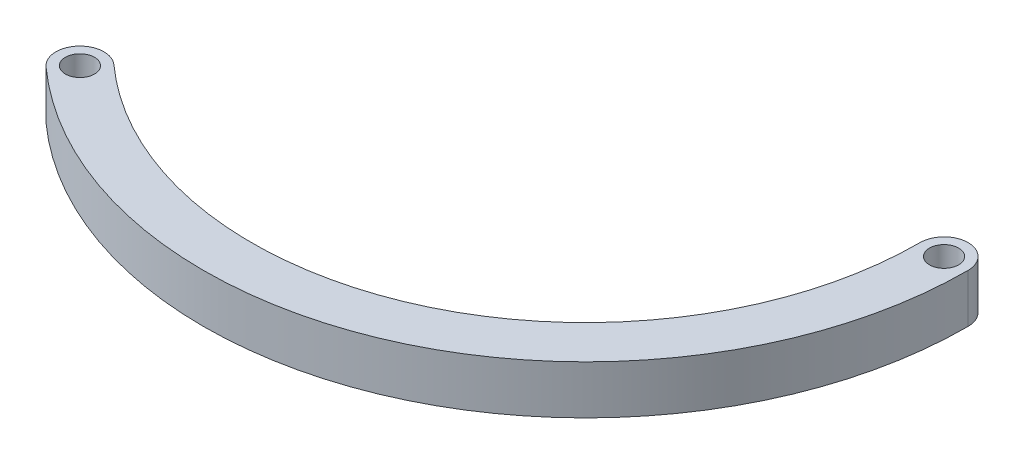
ISO-10303-21;
HEADER;
FILE_DESCRIPTION(('STEP AP214'),'2;1');
FILE_NAME('part.step','',(''),(''),'','','');
FILE_SCHEMA(('AUTOMOTIVE_DESIGN { 1 0 10303 214 1 1 1 1 }'));
ENDSEC;
DATA;
#1=APPLICATION_CONTEXT('core data for automotive mechanical design processes');
#2=APPLICATION_PROTOCOL_DEFINITION('international standard','automotive_design',2000,#1);
#3=PRODUCT_CONTEXT('',#1,'mechanical');
#4=PRODUCT('Part','Part','',(#3));
#5=PRODUCT_RELATED_PRODUCT_CATEGORY('part','',(#4));
#6=PRODUCT_DEFINITION_FORMATION('','',#4);
#7=PRODUCT_DEFINITION_CONTEXT('part definition',#1,'design');
#8=PRODUCT_DEFINITION('design','',#6,#7);
#9=PRODUCT_DEFINITION_SHAPE('','',#8);
#10=(LENGTH_UNIT() NAMED_UNIT(*) SI_UNIT(.MILLI.,.METRE.));
#11=(NAMED_UNIT(*) PLANE_ANGLE_UNIT() SI_UNIT($,.RADIAN.));
#12=(NAMED_UNIT(*) SI_UNIT($,.STERADIAN.) SOLID_ANGLE_UNIT());
#13=UNCERTAINTY_MEASURE_WITH_UNIT(LENGTH_MEASURE(1.E-05),#10,'distance_accuracy_value','');
#14=(GEOMETRIC_REPRESENTATION_CONTEXT(3) GLOBAL_UNCERTAINTY_ASSIGNED_CONTEXT((#13)) GLOBAL_UNIT_ASSIGNED_CONTEXT((#10,
#11,#12)) REPRESENTATION_CONTEXT('',''));
#15=CARTESIAN_POINT('',(0.,0.,0.));
#16=DIRECTION('',(0.,0.,1.));
#17=DIRECTION('',(1.,0.,0.));
#18=AXIS2_PLACEMENT_3D('',#15,#16,#17);
#19=CARTESIAN_POINT('',(0.,5.,0.));
#20=DIRECTION('',(0.,-1.,0.));
#21=DIRECTION('',(0.,0.,-1.));
#22=AXIS2_PLACEMENT_3D('',#19,#20,#21);
#23=CYLINDRICAL_SURFACE('',#22,39.35);
#24=CARTESIAN_POINT('',(0.,5.,0.));
#25=DIRECTION('',(0.,1.,0.));
#26=DIRECTION('',(0.,0.,1.));
#27=AXIS2_PLACEMENT_3D('',#24,#25,#26);
#28=CIRCLE('',#27,39.35);
#29=CARTESIAN_POINT('',(-26.2755837593032,5.,29.2919135275905));
#30=VERTEX_POINT('',#29);
#31=CARTESIAN_POINT('',(39.3499938175483,5.,-0.0220580804799307));
#32=VERTEX_POINT('',#31);
#33=EDGE_CURVE('E11',#30,#32,#28,.T.);
#34=ORIENTED_EDGE('',*,*,#33,.F.);
#35=DIRECTION('',(0.,1.,0.));
#36=VECTOR('',#35,1.);
#37=CARTESIAN_POINT('',(-26.2755837593032,0.,29.2919135275905));
#38=LINE('',#37,#36);
#39=CARTESIAN_POINT('',(-26.2755837593032,0.,29.2919135275905));
#40=VERTEX_POINT('',#39);
#41=EDGE_CURVE('E88',#40,#30,#38,.T.);
#42=ORIENTED_EDGE('',*,*,#41,.F.);
#43=CARTESIAN_POINT('',(0.,0.,0.));
#44=DIRECTION('',(0.,1.,0.));
#45=DIRECTION('',(0.,0.,1.));
#46=AXIS2_PLACEMENT_3D('',#43,#44,#45);
#47=CIRCLE('',#46,39.35);
#48=CARTESIAN_POINT('',(39.3499938175483,0.,-0.0220580804799397));
#49=VERTEX_POINT('',#48);
#50=EDGE_CURVE('E36',#40,#49,#47,.T.);
#51=ORIENTED_EDGE('',*,*,#50,.T.);
#52=DIRECTION('',(0.,1.,0.));
#53=VECTOR('',#52,1.);
#54=CARTESIAN_POINT('',(39.3499938175483,0.,-0.0220580804799397));
#55=LINE('',#54,#53);
#56=EDGE_CURVE('E105',#49,#32,#55,.T.);
#57=ORIENTED_EDGE('',*,*,#56,.T.);
#58=EDGE_LOOP('',(#34,#42,#51,#57));
#59=FACE_BOUND('',#58,.T.);
#60=ADVANCED_FACE('F33',(#59),#23,.T.);
#61=CARTESIAN_POINT('',(0.,5.,0.));
#62=DIRECTION('',(0.,1.,0.));
#63=DIRECTION('',(0.,0.,1.));
#64=AXIS2_PLACEMENT_3D('',#61,#62,#63);
#65=PLANE('',#64);
#66=CARTESIAN_POINT('',(36.8749942064064,5.,-0.0206706916822773));
#67=DIRECTION('',(0.,1.,0.));
#68=DIRECTION('',(0.,0.,1.));
#69=AXIS2_PLACEMENT_3D('',#66,#67,#68);
#70=CIRCLE('',#69,1.5);
#71=CARTESIAN_POINT('',(36.8749942064064,5.,1.47932930831773));
#72=VERTEX_POINT('',#71);
#73=EDGE_CURVE('E146',#72,#72,#70,.T.);
#74=ORIENTED_EDGE('',*,*,#73,.F.);
#75=EDGE_LOOP('',(#74));
#76=FACE_BOUND('',#75,.T.);
#77=CARTESIAN_POINT('',(-24.6229263309862,5.,27.4495377720432));
#78=DIRECTION('',(0.,1.,0.));
#79=DIRECTION('',(0.,0.,1.));
#80=AXIS2_PLACEMENT_3D('',#77,#78,#79);
#81=CIRCLE('',#80,1.5);
#82=CARTESIAN_POINT('',(-24.6229263309862,5.,28.9495377720432));
#83=VERTEX_POINT('',#82);
#84=EDGE_CURVE('E96',#83,#83,#81,.T.);
#85=ORIENTED_EDGE('',*,*,#84,.F.);
#86=EDGE_LOOP('',(#85));
#87=FACE_BOUND('',#86,.T.);
#88=CARTESIAN_POINT('',(0.,5.,0.));
#89=DIRECTION('',(0.,1.,0.));
#90=DIRECTION('',(0.,0.,1.));
#91=AXIS2_PLACEMENT_3D('',#88,#89,#90);
#92=CIRCLE('',#91,34.4);
#93=CARTESIAN_POINT('',(-22.9702689026691,5.,25.6071620164959));
#94=VERTEX_POINT('',#93);
#95=CARTESIAN_POINT('',(34.3999945952646,5.,-0.0192833028846232));
#96=VERTEX_POINT('',#95);
#97=EDGE_CURVE('E76',#94,#96,#92,.T.);
#98=ORIENTED_EDGE('',*,*,#97,.F.);
#99=CARTESIAN_POINT('',(-24.6229263309862,5.,27.4495377720432));
#100=DIRECTION('',(0.,1.,0.));
#101=DIRECTION('',(0.,0.,-1.));
#102=AXIS2_PLACEMENT_3D('',#99,#100,#101);
#103=CIRCLE('',#102,2.475);
#104=EDGE_CURVE('E79',#94,#30,#103,.T.);
#105=ORIENTED_EDGE('',*,*,#104,.T.);
#106=ORIENTED_EDGE('',*,*,#33,.T.);
#107=CARTESIAN_POINT('',(36.8749942064064,5.,-0.0206706916822773));
#108=DIRECTION('',(0.,1.,0.));
#109=DIRECTION('',(0.,0.,-1.));
#110=AXIS2_PLACEMENT_3D('',#107,#108,#109);
#111=CIRCLE('',#110,2.475);
#112=EDGE_CURVE('E81',#32,#96,#111,.T.);
#113=ORIENTED_EDGE('',*,*,#112,.T.);
#114=EDGE_LOOP('',(#98,#105,#106,#113));
#115=FACE_BOUND('',#114,.T.);
#116=ADVANCED_FACE('F77',(#76,#87,#115),#65,.T.);
#117=CARTESIAN_POINT('',(0.,0.,0.));
#118=DIRECTION('',(0.,1.,0.));
#119=DIRECTION('',(0.,0.,1.));
#120=AXIS2_PLACEMENT_3D('',#117,#118,#119);
#121=PLANE('',#120);
#122=CARTESIAN_POINT('',(36.8749942064064,0.,-0.0206706916822773));
#123=DIRECTION('',(0.,1.,0.));
#124=DIRECTION('',(0.,0.,1.));
#125=AXIS2_PLACEMENT_3D('',#122,#123,#124);
#126=CIRCLE('',#125,1.5);
#127=CARTESIAN_POINT('',(36.8749942064064,0.,1.47932930831773));
#128=VERTEX_POINT('',#127);
#129=EDGE_CURVE('E144',#128,#128,#126,.T.);
#130=ORIENTED_EDGE('',*,*,#129,.T.);
#131=EDGE_LOOP('',(#130));
#132=FACE_BOUND('',#131,.T.);
#133=CARTESIAN_POINT('',(-24.6229263309862,0.,27.4495377720432));
#134=DIRECTION('',(0.,1.,0.));
#135=DIRECTION('',(0.,0.,1.));
#136=AXIS2_PLACEMENT_3D('',#133,#134,#135);
#137=CIRCLE('',#136,1.5);
#138=CARTESIAN_POINT('',(-24.6229263309862,0.,28.9495377720432));
#139=VERTEX_POINT('',#138);
#140=EDGE_CURVE('E92',#139,#139,#137,.T.);
#141=ORIENTED_EDGE('',*,*,#140,.T.);
#142=EDGE_LOOP('',(#141));
#143=FACE_BOUND('',#142,.T.);
#144=ORIENTED_EDGE('',*,*,#50,.F.);
#145=CARTESIAN_POINT('',(-24.6229263309862,0.,27.4495377720432));
#146=DIRECTION('',(0.,1.,0.));
#147=DIRECTION('',(0.,0.,-1.));
#148=AXIS2_PLACEMENT_3D('',#145,#146,#147);
#149=CIRCLE('',#148,2.475);
#150=CARTESIAN_POINT('',(-22.9702689026691,0.,25.6071620164959));
#151=VERTEX_POINT('',#150);
#152=EDGE_CURVE('E91',#151,#40,#149,.T.);
#153=ORIENTED_EDGE('',*,*,#152,.F.);
#154=CARTESIAN_POINT('',(0.,0.,0.));
#155=DIRECTION('',(0.,1.,0.));
#156=DIRECTION('',(0.,0.,1.));
#157=AXIS2_PLACEMENT_3D('',#154,#155,#156);
#158=CIRCLE('',#157,34.4);
#159=CARTESIAN_POINT('',(34.3999945952645,0.,-0.0192833028846232));
#160=VERTEX_POINT('',#159);
#161=EDGE_CURVE('E52',#151,#160,#158,.T.);
#162=ORIENTED_EDGE('',*,*,#161,.T.);
#163=CARTESIAN_POINT('',(36.8749942064064,0.,-0.0206706916822773));
#164=DIRECTION('',(0.,1.,0.));
#165=DIRECTION('',(0.,0.,-1.));
#166=AXIS2_PLACEMENT_3D('',#163,#164,#165);
#167=CIRCLE('',#166,2.475);
#168=EDGE_CURVE('E100',#49,#160,#167,.T.);
#169=ORIENTED_EDGE('',*,*,#168,.F.);
#170=EDGE_LOOP('',(#144,#153,#162,#169));
#171=FACE_BOUND('',#170,.T.);
#172=ADVANCED_FACE('F110',(#132,#143,#171),#121,.F.);
#173=CARTESIAN_POINT('',(0.,0.,0.));
#174=DIRECTION('',(0.,1.,0.));
#175=DIRECTION('',(0.,0.,1.));
#176=AXIS2_PLACEMENT_3D('',#173,#174,#175);
#177=CYLINDRICAL_SURFACE('',#176,34.4);
#178=ORIENTED_EDGE('',*,*,#161,.F.);
#179=DIRECTION('',(0.,1.,0.));
#180=VECTOR('',#179,1.);
#181=CARTESIAN_POINT('',(-22.9702689026691,0.,25.6071620164959));
#182=LINE('',#181,#180);
#183=EDGE_CURVE('E82',#151,#94,#182,.T.);
#184=ORIENTED_EDGE('',*,*,#183,.T.);
#185=ORIENTED_EDGE('',*,*,#97,.T.);
#186=DIRECTION('',(0.,1.,0.));
#187=VECTOR('',#186,1.);
#188=CARTESIAN_POINT('',(34.3999945952646,0.,-0.0192833028846232));
#189=LINE('',#188,#187);
#190=EDGE_CURVE('E47',#160,#96,#189,.T.);
#191=ORIENTED_EDGE('',*,*,#190,.F.);
#192=EDGE_LOOP('',(#178,#184,#185,#191));
#193=FACE_BOUND('',#192,.T.);
#194=ADVANCED_FACE('F84',(#193),#177,.F.);
#195=CARTESIAN_POINT('',(36.8749942064064,0.,-0.0206706916822773));
#196=DIRECTION('',(0.,1.,0.));
#197=DIRECTION('',(0.,0.,1.));
#198=AXIS2_PLACEMENT_3D('',#195,#196,#197);
#199=CYLINDRICAL_SURFACE('',#198,2.475);
#200=ORIENTED_EDGE('',*,*,#112,.F.);
#201=ORIENTED_EDGE('',*,*,#56,.F.);
#202=ORIENTED_EDGE('',*,*,#168,.T.);
#203=ORIENTED_EDGE('',*,*,#190,.T.);
#204=EDGE_LOOP('',(#200,#201,#202,#203));
#205=FACE_BOUND('',#204,.T.);
#206=ADVANCED_FACE('F112',(#205),#199,.T.);
#207=CARTESIAN_POINT('',(-24.6229263309862,0.,27.4495377720432));
#208=DIRECTION('',(0.,1.,0.));
#209=DIRECTION('',(0.,0.,1.));
#210=AXIS2_PLACEMENT_3D('',#207,#208,#209);
#211=CYLINDRICAL_SURFACE('',#210,2.475);
#212=ORIENTED_EDGE('',*,*,#104,.F.);
#213=ORIENTED_EDGE('',*,*,#183,.F.);
#214=ORIENTED_EDGE('',*,*,#152,.T.);
#215=ORIENTED_EDGE('',*,*,#41,.T.);
#216=EDGE_LOOP('',(#212,#213,#214,#215));
#217=FACE_BOUND('',#216,.T.);
#218=ADVANCED_FACE('F90',(#217),#211,.T.);
#219=CARTESIAN_POINT('',(-24.6229263309862,0.,27.4495377720432));
#220=DIRECTION('',(0.,1.,0.));
#221=DIRECTION('',(0.,0.,1.));
#222=AXIS2_PLACEMENT_3D('',#219,#220,#221);
#223=CYLINDRICAL_SURFACE('',#222,1.5);
#224=ORIENTED_EDGE('',*,*,#140,.F.);
#225=EDGE_LOOP('',(#224));
#226=FACE_BOUND('',#225,.T.);
#227=ORIENTED_EDGE('',*,*,#84,.T.);
#228=EDGE_LOOP('',(#227));
#229=FACE_BOUND('',#228,.T.);
#230=ADVANCED_FACE('F132',(#226,#229),#223,.F.);
#231=CARTESIAN_POINT('',(36.8749942064064,0.,-0.0206706916822773));
#232=DIRECTION('',(0.,1.,0.));
#233=DIRECTION('',(0.,0.,1.));
#234=AXIS2_PLACEMENT_3D('',#231,#232,#233);
#235=CYLINDRICAL_SURFACE('',#234,1.5);
#236=ORIENTED_EDGE('',*,*,#129,.F.);
#237=EDGE_LOOP('',(#236));
#238=FACE_BOUND('',#237,.T.);
#239=ORIENTED_EDGE('',*,*,#73,.T.);
#240=EDGE_LOOP('',(#239));
#241=FACE_BOUND('',#240,.T.);
#242=ADVANCED_FACE('F135',(#238,#241),#235,.F.);
#243=CLOSED_SHELL('',(#60,#116,#172,#194,#206,#218,#230,#242));
#244=MANIFOLD_SOLID_BREP('B2',#243);
#245=ADVANCED_BREP_SHAPE_REPRESENTATION('',(#18,#244),#14);
#246=SHAPE_DEFINITION_REPRESENTATION(#9,#245);
ENDSEC;
END-ISO-10303-21;
